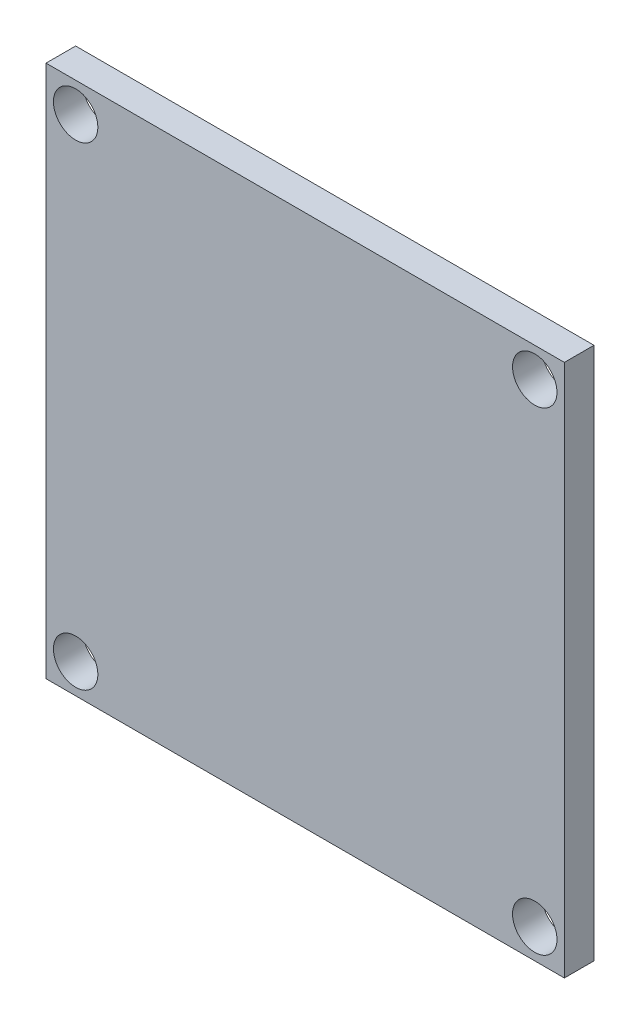
ISO-10303-21;
HEADER;
FILE_DESCRIPTION(('STEP AP214'),'2;1');
FILE_NAME('part.step','',(''),(''),'','','');
FILE_SCHEMA(('AUTOMOTIVE_DESIGN { 1 0 10303 214 1 1 1 1 }'));
ENDSEC;
DATA;
#1=APPLICATION_CONTEXT('core data for automotive mechanical design processes');
#2=APPLICATION_PROTOCOL_DEFINITION('international standard','automotive_design',2000,#1);
#3=PRODUCT_CONTEXT('',#1,'mechanical');
#4=PRODUCT('Part','Part','',(#3));
#5=PRODUCT_RELATED_PRODUCT_CATEGORY('part','',(#4));
#6=PRODUCT_DEFINITION_FORMATION('','',#4);
#7=PRODUCT_DEFINITION_CONTEXT('part definition',#1,'design');
#8=PRODUCT_DEFINITION('design','',#6,#7);
#9=PRODUCT_DEFINITION_SHAPE('','',#8);
#10=(LENGTH_UNIT() NAMED_UNIT(*) SI_UNIT(.MILLI.,.METRE.));
#11=(NAMED_UNIT(*) PLANE_ANGLE_UNIT() SI_UNIT($,.RADIAN.));
#12=(NAMED_UNIT(*) SI_UNIT($,.STERADIAN.) SOLID_ANGLE_UNIT());
#13=UNCERTAINTY_MEASURE_WITH_UNIT(LENGTH_MEASURE(1.E-05),#10,'distance_accuracy_value','');
#14=(GEOMETRIC_REPRESENTATION_CONTEXT(3) GLOBAL_UNCERTAINTY_ASSIGNED_CONTEXT((#13)) GLOBAL_UNIT_ASSIGNED_CONTEXT((#10,
#11,#12)) REPRESENTATION_CONTEXT('',''));
#15=CARTESIAN_POINT('',(0.,0.,0.));
#16=DIRECTION('',(0.,0.,1.));
#17=DIRECTION('',(1.,0.,0.));
#18=AXIS2_PLACEMENT_3D('',#15,#16,#17);
#19=CARTESIAN_POINT('',(17.5,18.,2.));
#20=DIRECTION('',(-1.,0.,0.));
#21=DIRECTION('',(0.,-1.,0.));
#22=AXIS2_PLACEMENT_3D('',#19,#20,#21);
#23=PLANE('',#22);
#24=DIRECTION('',(0.,1.,0.));
#25=VECTOR('',#24,1.);
#26=CARTESIAN_POINT('',(17.5,18.,0.));
#27=LINE('',#26,#25);
#28=CARTESIAN_POINT('',(17.5,-18.,0.));
#29=VERTEX_POINT('',#28);
#30=CARTESIAN_POINT('',(17.5,18.,0.));
#31=VERTEX_POINT('',#30);
#32=EDGE_CURVE('E98',#29,#31,#27,.T.);
#33=ORIENTED_EDGE('',*,*,#32,.T.);
#34=DIRECTION('',(0.,0.,-1.));
#35=VECTOR('',#34,1.);
#36=CARTESIAN_POINT('',(17.5,18.,2.));
#37=LINE('',#36,#35);
#38=CARTESIAN_POINT('',(17.5,18.,2.));
#39=VERTEX_POINT('',#38);
#40=EDGE_CURVE('E11',#39,#31,#37,.T.);
#41=ORIENTED_EDGE('',*,*,#40,.F.);
#42=DIRECTION('',(0.,1.,0.));
#43=VECTOR('',#42,1.);
#44=CARTESIAN_POINT('',(17.5,18.,2.));
#45=LINE('',#44,#43);
#46=CARTESIAN_POINT('',(17.5,-18.,2.));
#47=VERTEX_POINT('',#46);
#48=EDGE_CURVE('E86',#47,#39,#45,.T.);
#49=ORIENTED_EDGE('',*,*,#48,.F.);
#50=DIRECTION('',(0.,0.,-1.));
#51=VECTOR('',#50,1.);
#52=CARTESIAN_POINT('',(17.5,-18.,2.));
#53=LINE('',#52,#51);
#54=EDGE_CURVE('E94',#47,#29,#53,.T.);
#55=ORIENTED_EDGE('',*,*,#54,.T.);
#56=EDGE_LOOP('',(#33,#41,#49,#55));
#57=FACE_BOUND('',#56,.T.);
#58=ADVANCED_FACE('F35',(#57),#23,.F.);
#59=CARTESIAN_POINT('',(-17.5,18.,2.));
#60=DIRECTION('',(0.,-1.,0.));
#61=DIRECTION('',(0.,0.,-1.));
#62=AXIS2_PLACEMENT_3D('',#59,#60,#61);
#63=PLANE('',#62);
#64=DIRECTION('',(-1.,0.,0.));
#65=VECTOR('',#64,1.);
#66=CARTESIAN_POINT('',(-17.5,18.,0.));
#67=LINE('',#66,#65);
#68=CARTESIAN_POINT('',(-17.5,18.,0.));
#69=VERTEX_POINT('',#68);
#70=EDGE_CURVE('E90',#31,#69,#67,.T.);
#71=ORIENTED_EDGE('',*,*,#70,.T.);
#72=DIRECTION('',(0.,0.,-1.));
#73=VECTOR('',#72,1.);
#74=CARTESIAN_POINT('',(-17.5,18.,2.));
#75=LINE('',#74,#73);
#76=CARTESIAN_POINT('',(-17.5,18.,2.));
#77=VERTEX_POINT('',#76);
#78=EDGE_CURVE('E43',#77,#69,#75,.T.);
#79=ORIENTED_EDGE('',*,*,#78,.F.);
#80=DIRECTION('',(-1.,0.,0.));
#81=VECTOR('',#80,1.);
#82=CARTESIAN_POINT('',(-17.5,18.,2.));
#83=LINE('',#82,#81);
#84=EDGE_CURVE('E81',#39,#77,#83,.T.);
#85=ORIENTED_EDGE('',*,*,#84,.F.);
#86=ORIENTED_EDGE('',*,*,#40,.T.);
#87=EDGE_LOOP('',(#71,#79,#85,#86));
#88=FACE_BOUND('',#87,.T.);
#89=ADVANCED_FACE('F89',(#88),#63,.F.);
#90=CARTESIAN_POINT('',(-17.5,18.,2.));
#91=DIRECTION('',(1.,0.,0.));
#92=DIRECTION('',(0.,1.,0.));
#93=AXIS2_PLACEMENT_3D('',#90,#91,#92);
#94=PLANE('',#93);
#95=DIRECTION('',(0.,-1.,0.));
#96=VECTOR('',#95,1.);
#97=CARTESIAN_POINT('',(-17.5,18.,0.));
#98=LINE('',#97,#96);
#99=CARTESIAN_POINT('',(-17.5,-18.,0.));
#100=VERTEX_POINT('',#99);
#101=EDGE_CURVE('E68',#69,#100,#98,.T.);
#102=ORIENTED_EDGE('',*,*,#101,.T.);
#103=DIRECTION('',(0.,0.,-1.));
#104=VECTOR('',#103,1.);
#105=CARTESIAN_POINT('',(-17.5,-18.,2.));
#106=LINE('',#105,#104);
#107=CARTESIAN_POINT('',(-17.5,-18.,2.));
#108=VERTEX_POINT('',#107);
#109=EDGE_CURVE('E91',#108,#100,#106,.T.);
#110=ORIENTED_EDGE('',*,*,#109,.F.);
#111=DIRECTION('',(0.,-1.,0.));
#112=VECTOR('',#111,1.);
#113=CARTESIAN_POINT('',(-17.5,18.,2.));
#114=LINE('',#113,#112);
#115=EDGE_CURVE('E84',#77,#108,#114,.T.);
#116=ORIENTED_EDGE('',*,*,#115,.F.);
#117=ORIENTED_EDGE('',*,*,#78,.T.);
#118=EDGE_LOOP('',(#102,#110,#116,#117));
#119=FACE_BOUND('',#118,.T.);
#120=ADVANCED_FACE('F92',(#119),#94,.F.);
#121=CARTESIAN_POINT('',(-17.5,-18.,2.));
#122=DIRECTION('',(0.,1.,0.));
#123=DIRECTION('',(0.,0.,1.));
#124=AXIS2_PLACEMENT_3D('',#121,#122,#123);
#125=PLANE('',#124);
#126=DIRECTION('',(1.,0.,0.));
#127=VECTOR('',#126,1.);
#128=CARTESIAN_POINT('',(-17.5,-18.,0.));
#129=LINE('',#128,#127);
#130=EDGE_CURVE('E74',#100,#29,#129,.T.);
#131=ORIENTED_EDGE('',*,*,#130,.T.);
#132=ORIENTED_EDGE('',*,*,#54,.F.);
#133=DIRECTION('',(1.,0.,0.));
#134=VECTOR('',#133,1.);
#135=CARTESIAN_POINT('',(-17.5,-18.,2.));
#136=LINE('',#135,#134);
#137=EDGE_CURVE('E51',#108,#47,#136,.T.);
#138=ORIENTED_EDGE('',*,*,#137,.F.);
#139=ORIENTED_EDGE('',*,*,#109,.T.);
#140=EDGE_LOOP('',(#131,#132,#138,#139));
#141=FACE_BOUND('',#140,.T.);
#142=ADVANCED_FACE('F106',(#141),#125,.F.);
#143=CARTESIAN_POINT('',(0.,0.,2.));
#144=DIRECTION('',(0.,0.,1.));
#145=DIRECTION('',(1.,0.,0.));
#146=AXIS2_PLACEMENT_3D('',#143,#144,#145);
#147=PLANE('',#146);
#148=CARTESIAN_POINT('',(15.5,16.,2.));
#149=DIRECTION('',(0.,0.,1.));
#150=DIRECTION('',(1.,0.,0.));
#151=AXIS2_PLACEMENT_3D('',#148,#149,#150);
#152=CIRCLE('',#151,1.5);
#153=CARTESIAN_POINT('',(17.,16.,2.));
#154=VERTEX_POINT('',#153);
#155=EDGE_CURVE('E128',#154,#154,#152,.T.);
#156=ORIENTED_EDGE('',*,*,#155,.F.);
#157=EDGE_LOOP('',(#156));
#158=FACE_BOUND('',#157,.T.);
#159=CARTESIAN_POINT('',(15.5,-16.,2.));
#160=DIRECTION('',(0.,0.,1.));
#161=DIRECTION('',(1.,0.,0.));
#162=AXIS2_PLACEMENT_3D('',#159,#160,#161);
#163=CIRCLE('',#162,1.5);
#164=CARTESIAN_POINT('',(17.,-16.,2.));
#165=VERTEX_POINT('',#164);
#166=EDGE_CURVE('E121',#165,#165,#163,.T.);
#167=ORIENTED_EDGE('',*,*,#166,.F.);
#168=EDGE_LOOP('',(#167));
#169=FACE_BOUND('',#168,.T.);
#170=CARTESIAN_POINT('',(-15.5,-16.,2.));
#171=DIRECTION('',(0.,0.,1.));
#172=DIRECTION('',(1.,0.,0.));
#173=AXIS2_PLACEMENT_3D('',#170,#171,#172);
#174=CIRCLE('',#173,1.5);
#175=CARTESIAN_POINT('',(-14.,-16.,2.));
#176=VERTEX_POINT('',#175);
#177=EDGE_CURVE('E122',#176,#176,#174,.T.);
#178=ORIENTED_EDGE('',*,*,#177,.F.);
#179=EDGE_LOOP('',(#178));
#180=FACE_BOUND('',#179,.T.);
#181=CARTESIAN_POINT('',(-15.5,16.,2.));
#182=DIRECTION('',(0.,0.,1.));
#183=DIRECTION('',(1.,0.,0.));
#184=AXIS2_PLACEMENT_3D('',#181,#182,#183);
#185=CIRCLE('',#184,1.5);
#186=CARTESIAN_POINT('',(-14.,16.,2.));
#187=VERTEX_POINT('',#186);
#188=EDGE_CURVE('E114',#187,#187,#185,.T.);
#189=ORIENTED_EDGE('',*,*,#188,.F.);
#190=EDGE_LOOP('',(#189));
#191=FACE_BOUND('',#190,.T.);
#192=ORIENTED_EDGE('',*,*,#48,.T.);
#193=ORIENTED_EDGE('',*,*,#84,.T.);
#194=ORIENTED_EDGE('',*,*,#115,.T.);
#195=ORIENTED_EDGE('',*,*,#137,.T.);
#196=EDGE_LOOP('',(#192,#193,#194,#195));
#197=FACE_BOUND('',#196,.T.);
#198=ADVANCED_FACE('F82',(#158,#169,#180,#191,#197),#147,.T.);
#199=CARTESIAN_POINT('',(0.,0.,0.));
#200=DIRECTION('',(0.,0.,1.));
#201=DIRECTION('',(1.,0.,0.));
#202=AXIS2_PLACEMENT_3D('',#199,#200,#201);
#203=PLANE('',#202);
#204=CARTESIAN_POINT('',(15.5,16.,0.));
#205=DIRECTION('',(0.,0.,1.));
#206=DIRECTION('',(1.,0.,0.));
#207=AXIS2_PLACEMENT_3D('',#204,#205,#206);
#208=CIRCLE('',#207,1.5);
#209=CARTESIAN_POINT('',(17.,16.,0.));
#210=VERTEX_POINT('',#209);
#211=EDGE_CURVE('E117',#210,#210,#208,.F.);
#212=ORIENTED_EDGE('',*,*,#211,.F.);
#213=EDGE_LOOP('',(#212));
#214=FACE_BOUND('',#213,.T.);
#215=CARTESIAN_POINT('',(15.5,-16.,0.));
#216=DIRECTION('',(0.,0.,1.));
#217=DIRECTION('',(1.,0.,0.));
#218=AXIS2_PLACEMENT_3D('',#215,#216,#217);
#219=CIRCLE('',#218,1.5);
#220=CARTESIAN_POINT('',(17.,-16.,0.));
#221=VERTEX_POINT('',#220);
#222=EDGE_CURVE('E125',#221,#221,#219,.F.);
#223=ORIENTED_EDGE('',*,*,#222,.F.);
#224=EDGE_LOOP('',(#223));
#225=FACE_BOUND('',#224,.T.);
#226=CARTESIAN_POINT('',(-15.5,-16.,0.));
#227=DIRECTION('',(0.,0.,1.));
#228=DIRECTION('',(1.,0.,0.));
#229=AXIS2_PLACEMENT_3D('',#226,#227,#228);
#230=CIRCLE('',#229,1.5);
#231=CARTESIAN_POINT('',(-14.,-16.,0.));
#232=VERTEX_POINT('',#231);
#233=EDGE_CURVE('E118',#232,#232,#230,.F.);
#234=ORIENTED_EDGE('',*,*,#233,.F.);
#235=EDGE_LOOP('',(#234));
#236=FACE_BOUND('',#235,.T.);
#237=CARTESIAN_POINT('',(-15.5,16.,0.));
#238=DIRECTION('',(0.,0.,1.));
#239=DIRECTION('',(1.,0.,0.));
#240=AXIS2_PLACEMENT_3D('',#237,#238,#239);
#241=CIRCLE('',#240,1.5);
#242=CARTESIAN_POINT('',(-14.,16.,0.));
#243=VERTEX_POINT('',#242);
#244=EDGE_CURVE('E101',#243,#243,#241,.F.);
#245=ORIENTED_EDGE('',*,*,#244,.F.);
#246=EDGE_LOOP('',(#245));
#247=FACE_BOUND('',#246,.T.);
#248=ORIENTED_EDGE('',*,*,#32,.F.);
#249=ORIENTED_EDGE('',*,*,#130,.F.);
#250=ORIENTED_EDGE('',*,*,#101,.F.);
#251=ORIENTED_EDGE('',*,*,#70,.F.);
#252=EDGE_LOOP('',(#248,#249,#250,#251));
#253=FACE_BOUND('',#252,.T.);
#254=ADVANCED_FACE('F109',(#214,#225,#236,#247,#253),#203,.F.);
#255=CARTESIAN_POINT('',(-15.5,16.,-0.00100000000000013));
#256=DIRECTION('',(0.,0.,1.));
#257=DIRECTION('',(1.,0.,0.));
#258=AXIS2_PLACEMENT_3D('',#255,#256,#257);
#259=CYLINDRICAL_SURFACE('',#258,1.5);
#260=ORIENTED_EDGE('',*,*,#188,.T.);
#261=EDGE_LOOP('',(#260));
#262=FACE_BOUND('',#261,.T.);
#263=ORIENTED_EDGE('',*,*,#244,.T.);
#264=EDGE_LOOP('',(#263));
#265=FACE_BOUND('',#264,.T.);
#266=ADVANCED_FACE('F148',(#262,#265),#259,.F.);
#267=CARTESIAN_POINT('',(-15.5,-16.,-0.00100000000000013));
#268=DIRECTION('',(0.,0.,1.));
#269=DIRECTION('',(1.,0.,0.));
#270=AXIS2_PLACEMENT_3D('',#267,#268,#269);
#271=CYLINDRICAL_SURFACE('',#270,1.5);
#272=ORIENTED_EDGE('',*,*,#177,.T.);
#273=EDGE_LOOP('',(#272));
#274=FACE_BOUND('',#273,.T.);
#275=ORIENTED_EDGE('',*,*,#233,.T.);
#276=EDGE_LOOP('',(#275));
#277=FACE_BOUND('',#276,.T.);
#278=ADVANCED_FACE('F151',(#274,#277),#271,.F.);
#279=CARTESIAN_POINT('',(15.5,-16.,-0.00100000000000013));
#280=DIRECTION('',(0.,0.,1.));
#281=DIRECTION('',(1.,0.,0.));
#282=AXIS2_PLACEMENT_3D('',#279,#280,#281);
#283=CYLINDRICAL_SURFACE('',#282,1.5);
#284=ORIENTED_EDGE('',*,*,#166,.T.);
#285=EDGE_LOOP('',(#284));
#286=FACE_BOUND('',#285,.T.);
#287=ORIENTED_EDGE('',*,*,#222,.T.);
#288=EDGE_LOOP('',(#287));
#289=FACE_BOUND('',#288,.T.);
#290=ADVANCED_FACE('F199',(#286,#289),#283,.F.);
#291=CARTESIAN_POINT('',(15.5,16.,-0.00100000000000013));
#292=DIRECTION('',(0.,0.,1.));
#293=DIRECTION('',(1.,0.,0.));
#294=AXIS2_PLACEMENT_3D('',#291,#292,#293);
#295=CYLINDRICAL_SURFACE('',#294,1.5);
#296=ORIENTED_EDGE('',*,*,#155,.T.);
#297=EDGE_LOOP('',(#296));
#298=FACE_BOUND('',#297,.T.);
#299=ORIENTED_EDGE('',*,*,#211,.T.);
#300=EDGE_LOOP('',(#299));
#301=FACE_BOUND('',#300,.T.);
#302=ADVANCED_FACE('F136',(#298,#301),#295,.F.);
#303=CLOSED_SHELL('',(#58,#89,#120,#142,#198,#254,#266,#278,#290,#302));
#304=MANIFOLD_SOLID_BREP('B2',#303);
#305=ADVANCED_BREP_SHAPE_REPRESENTATION('',(#18,#304),#14);
#306=SHAPE_DEFINITION_REPRESENTATION(#9,#305);
ENDSEC;
END-ISO-10303-21;
